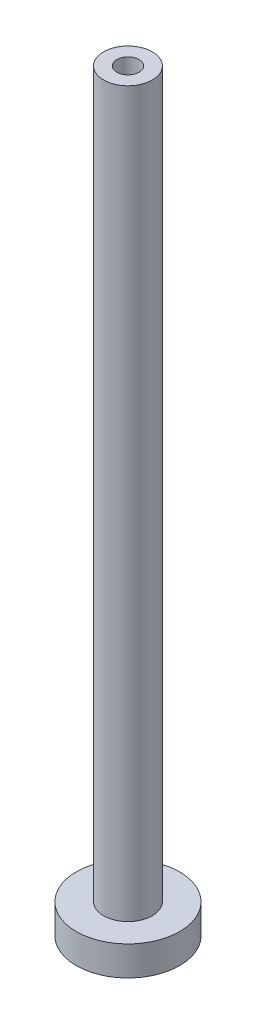
ISO-10303-21;
HEADER;
FILE_DESCRIPTION(('STEP AP214'),'2;1');
FILE_NAME('part.step','',(''),(''),'','','');
FILE_SCHEMA(('AUTOMOTIVE_DESIGN { 1 0 10303 214 1 1 1 1 }'));
ENDSEC;
DATA;
#1=APPLICATION_CONTEXT('core data for automotive mechanical design processes');
#2=APPLICATION_PROTOCOL_DEFINITION('international standard','automotive_design',2000,#1);
#3=PRODUCT_CONTEXT('',#1,'mechanical');
#4=PRODUCT('Part','Part','',(#3));
#5=PRODUCT_RELATED_PRODUCT_CATEGORY('part','',(#4));
#6=PRODUCT_DEFINITION_FORMATION('','',#4);
#7=PRODUCT_DEFINITION_CONTEXT('part definition',#1,'design');
#8=PRODUCT_DEFINITION('design','',#6,#7);
#9=PRODUCT_DEFINITION_SHAPE('','',#8);
#10=(LENGTH_UNIT() NAMED_UNIT(*) SI_UNIT(.MILLI.,.METRE.));
#11=(NAMED_UNIT(*) PLANE_ANGLE_UNIT() SI_UNIT($,.RADIAN.));
#12=(NAMED_UNIT(*) SI_UNIT($,.STERADIAN.) SOLID_ANGLE_UNIT());
#13=UNCERTAINTY_MEASURE_WITH_UNIT(LENGTH_MEASURE(1.E-05),#10,'distance_accuracy_value','');
#14=(GEOMETRIC_REPRESENTATION_CONTEXT(3) GLOBAL_UNCERTAINTY_ASSIGNED_CONTEXT((#13)) GLOBAL_UNIT_ASSIGNED_CONTEXT((#10,
#11,#12)) REPRESENTATION_CONTEXT('',''));
#15=CARTESIAN_POINT('',(0.,0.,0.));
#16=DIRECTION('',(0.,0.,1.));
#17=DIRECTION('',(1.,0.,0.));
#18=AXIS2_PLACEMENT_3D('',#15,#16,#17);
#19=CARTESIAN_POINT('',(0.,4.,0.));
#20=DIRECTION('',(0.,-1.,0.));
#21=DIRECTION('',(0.,0.,-1.));
#22=AXIS2_PLACEMENT_3D('',#19,#20,#21);
#23=CYLINDRICAL_SURFACE('',#22,7.);
#24=CARTESIAN_POINT('',(0.,4.,0.));
#25=DIRECTION('',(0.,1.,0.));
#26=DIRECTION('',(0.,0.,1.));
#27=AXIS2_PLACEMENT_3D('',#24,#25,#26);
#28=CIRCLE('',#27,7.);
#29=CARTESIAN_POINT('',(0.,4.,7.));
#30=VERTEX_POINT('',#29);
#31=EDGE_CURVE('E51',#30,#30,#28,.T.);
#32=ORIENTED_EDGE('',*,*,#31,.F.);
#33=EDGE_LOOP('',(#32));
#34=FACE_BOUND('',#33,.T.);
#35=CARTESIAN_POINT('',(0.,0.,0.));
#36=DIRECTION('',(0.,1.,0.));
#37=DIRECTION('',(0.,0.,1.));
#38=AXIS2_PLACEMENT_3D('',#35,#36,#37);
#39=CIRCLE('',#38,7.);
#40=CARTESIAN_POINT('',(0.,0.,7.));
#41=VERTEX_POINT('',#40);
#42=EDGE_CURVE('E46',#41,#41,#39,.T.);
#43=ORIENTED_EDGE('',*,*,#42,.T.);
#44=EDGE_LOOP('',(#43));
#45=FACE_BOUND('',#44,.T.);
#46=ADVANCED_FACE('F43',(#34,#45),#23,.T.);
#47=CARTESIAN_POINT('',(0.,4.,0.));
#48=DIRECTION('',(0.,1.,0.));
#49=DIRECTION('',(0.,0.,1.));
#50=AXIS2_PLACEMENT_3D('',#47,#48,#49);
#51=PLANE('',#50);
#52=CARTESIAN_POINT('',(0.,4.,0.));
#53=DIRECTION('',(0.,1.,0.));
#54=DIRECTION('',(0.,0.,1.));
#55=AXIS2_PLACEMENT_3D('',#52,#53,#54);
#56=CIRCLE('',#55,3.3);
#57=CARTESIAN_POINT('',(0.,4.,3.3));
#58=VERTEX_POINT('',#57);
#59=EDGE_CURVE('E10',#58,#58,#56,.T.);
#60=ORIENTED_EDGE('',*,*,#59,.F.);
#61=EDGE_LOOP('',(#60));
#62=FACE_BOUND('',#61,.T.);
#63=ORIENTED_EDGE('',*,*,#31,.T.);
#64=EDGE_LOOP('',(#63));
#65=FACE_BOUND('',#64,.T.);
#66=ADVANCED_FACE('F93',(#62,#65),#51,.T.);
#67=CARTESIAN_POINT('',(0.,0.,0.));
#68=DIRECTION('',(0.,1.,0.));
#69=DIRECTION('',(0.,0.,1.));
#70=AXIS2_PLACEMENT_3D('',#67,#68,#69);
#71=PLANE('',#70);
#72=CARTESIAN_POINT('',(0.,0.,0.));
#73=DIRECTION('',(0.,1.,0.));
#74=DIRECTION('',(0.,0.,1.));
#75=AXIS2_PLACEMENT_3D('',#72,#73,#74);
#76=CIRCLE('',#75,1.5);
#77=CARTESIAN_POINT('',(0.,0.,1.5));
#78=VERTEX_POINT('',#77);
#79=EDGE_CURVE('E62',#78,#78,#76,.T.);
#80=ORIENTED_EDGE('',*,*,#79,.T.);
#81=EDGE_LOOP('',(#80));
#82=FACE_BOUND('',#81,.T.);
#83=ORIENTED_EDGE('',*,*,#42,.F.);
#84=EDGE_LOOP('',(#83));
#85=FACE_BOUND('',#84,.T.);
#86=ADVANCED_FACE('F71',(#82,#85),#71,.F.);
#87=CARTESIAN_POINT('',(0.,90.,0.));
#88=DIRECTION('',(0.,-1.,0.));
#89=DIRECTION('',(0.,0.,-1.));
#90=AXIS2_PLACEMENT_3D('',#87,#88,#89);
#91=CYLINDRICAL_SURFACE('',#90,3.3);
#92=ORIENTED_EDGE('',*,*,#59,.T.);
#93=EDGE_LOOP('',(#92));
#94=FACE_BOUND('',#93,.T.);
#95=CARTESIAN_POINT('',(0.,102.,0.));
#96=DIRECTION('',(0.,1.,0.));
#97=DIRECTION('',(0.,0.,1.));
#98=AXIS2_PLACEMENT_3D('',#95,#96,#97);
#99=CIRCLE('',#98,3.3);
#100=CARTESIAN_POINT('',(0.,102.,3.3));
#101=VERTEX_POINT('',#100);
#102=EDGE_CURVE('E58',#101,#101,#99,.T.);
#103=ORIENTED_EDGE('',*,*,#102,.F.);
#104=EDGE_LOOP('',(#103));
#105=FACE_BOUND('',#104,.T.);
#106=ADVANCED_FACE('F83',(#94,#105),#91,.T.);
#107=CARTESIAN_POINT('',(0.,102.,0.));
#108=DIRECTION('',(0.,1.,0.));
#109=DIRECTION('',(0.,0.,1.));
#110=AXIS2_PLACEMENT_3D('',#107,#108,#109);
#111=PLANE('',#110);
#112=CARTESIAN_POINT('',(0.,102.,0.));
#113=DIRECTION('',(0.,1.,0.));
#114=DIRECTION('',(0.,0.,1.));
#115=AXIS2_PLACEMENT_3D('',#112,#113,#114);
#116=CIRCLE('',#115,1.5);
#117=CARTESIAN_POINT('',(0.,102.,1.5));
#118=VERTEX_POINT('',#117);
#119=EDGE_CURVE('E63',#118,#118,#116,.T.);
#120=ORIENTED_EDGE('',*,*,#119,.F.);
#121=EDGE_LOOP('',(#120));
#122=FACE_BOUND('',#121,.T.);
#123=ORIENTED_EDGE('',*,*,#102,.T.);
#124=EDGE_LOOP('',(#123));
#125=FACE_BOUND('',#124,.T.);
#126=ADVANCED_FACE('F77',(#122,#125),#111,.T.);
#127=CARTESIAN_POINT('',(0.,0.,0.));
#128=DIRECTION('',(0.,1.,0.));
#129=DIRECTION('',(0.,0.,1.));
#130=AXIS2_PLACEMENT_3D('',#127,#128,#129);
#131=CYLINDRICAL_SURFACE('',#130,1.5);
#132=ORIENTED_EDGE('',*,*,#79,.F.);
#133=EDGE_LOOP('',(#132));
#134=FACE_BOUND('',#133,.T.);
#135=ORIENTED_EDGE('',*,*,#119,.T.);
#136=EDGE_LOOP('',(#135));
#137=FACE_BOUND('',#136,.T.);
#138=ADVANCED_FACE('F74',(#134,#137),#131,.F.);
#139=CLOSED_SHELL('',(#46,#66,#86,#106,#126,#138));
#140=MANIFOLD_SOLID_BREP('B2',#139);
#141=ADVANCED_BREP_SHAPE_REPRESENTATION('',(#18,#140),#14);
#142=SHAPE_DEFINITION_REPRESENTATION(#9,#141);
ENDSEC;
END-ISO-10303-21;
